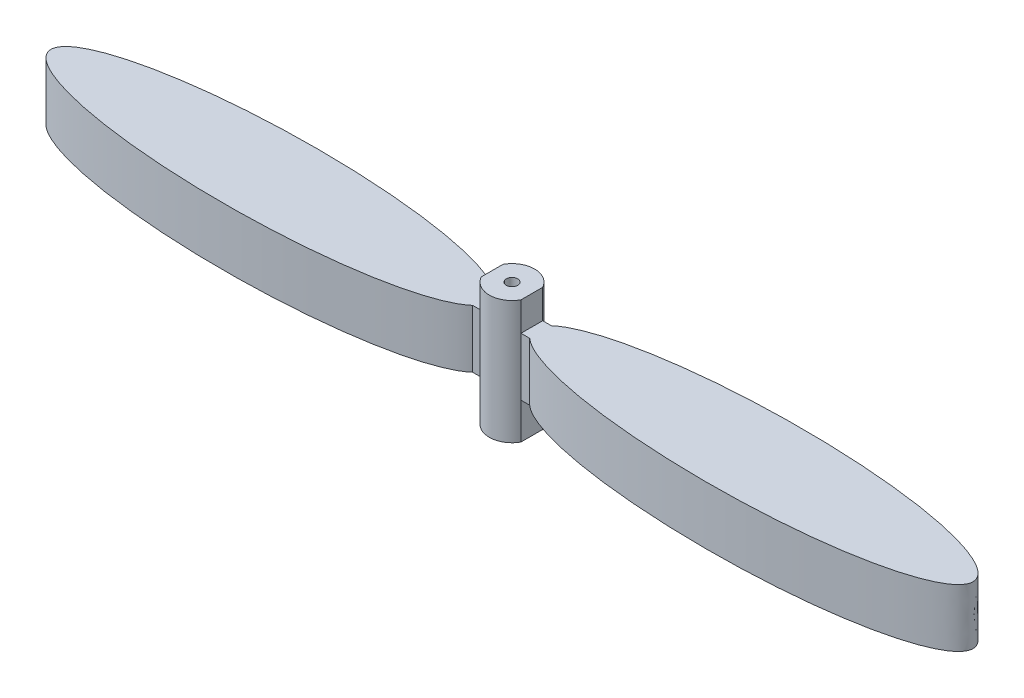
ISO-10303-21;
HEADER;
FILE_DESCRIPTION(('STEP AP214'),'2;1');
FILE_NAME('part.step','',(''),(''),'','','');
FILE_SCHEMA(('AUTOMOTIVE_DESIGN { 1 0 10303 214 1 1 1 1 }'));
ENDSEC;
DATA;
#1=APPLICATION_CONTEXT('core data for automotive mechanical design processes');
#2=APPLICATION_PROTOCOL_DEFINITION('international standard','automotive_design',2000,#1);
#3=PRODUCT_CONTEXT('',#1,'mechanical');
#4=PRODUCT('Part','Part','',(#3));
#5=PRODUCT_RELATED_PRODUCT_CATEGORY('part','',(#4));
#6=PRODUCT_DEFINITION_FORMATION('','',#4);
#7=PRODUCT_DEFINITION_CONTEXT('part definition',#1,'design');
#8=PRODUCT_DEFINITION('design','',#6,#7);
#9=PRODUCT_DEFINITION_SHAPE('','',#8);
#10=(LENGTH_UNIT() NAMED_UNIT(*) SI_UNIT(.MILLI.,.METRE.));
#11=(NAMED_UNIT(*) PLANE_ANGLE_UNIT() SI_UNIT($,.RADIAN.));
#12=(NAMED_UNIT(*) SI_UNIT($,.STERADIAN.) SOLID_ANGLE_UNIT());
#13=UNCERTAINTY_MEASURE_WITH_UNIT(LENGTH_MEASURE(1.E-05),#10,'distance_accuracy_value','');
#14=(GEOMETRIC_REPRESENTATION_CONTEXT(3) GLOBAL_UNCERTAINTY_ASSIGNED_CONTEXT((#13)) GLOBAL_UNIT_ASSIGNED_CONTEXT((#10,
#11,#12)) REPRESENTATION_CONTEXT('',''));
#15=CARTESIAN_POINT('',(0.,0.,0.));
#16=DIRECTION('',(0.,0.,1.));
#17=DIRECTION('',(1.,0.,0.));
#18=AXIS2_PLACEMENT_3D('',#15,#16,#17);
#19=CARTESIAN_POINT('',(-66.75,34.,0.));
#20=DIRECTION('',(0.,1.,0.));
#21=DIRECTION('',(0.,0.,1.));
#22=AXIS2_PLACEMENT_3D('',#19,#20,#21);
#23=PLANE('',#22);
#24=DIRECTION('',(0.,0.,1.));
#25=VECTOR('',#24,1.);
#26=CARTESIAN_POINT('',(5.48292804986533,34.,-17.));
#27=LINE('',#26,#25);
#28=CARTESIAN_POINT('',(5.48292804986533,34.,-3.));
#29=VERTEX_POINT('',#28);
#30=CARTESIAN_POINT('',(5.48292804986533,34.,3.));
#31=VERTEX_POINT('',#30);
#32=EDGE_CURVE('E256',#29,#31,#27,.T.);
#33=ORIENTED_EDGE('',*,*,#32,.F.);
#34=CARTESIAN_POINT('',(0.,34.,0.));
#35=DIRECTION('',(0.,1.,0.));
#36=DIRECTION('',(0.,0.,1.));
#37=AXIS2_PLACEMENT_3D('',#34,#35,#36);
#38=CIRCLE('',#37,6.25);
#39=CARTESIAN_POINT('',(-5.48292804986533,34.,-3.));
#40=VERTEX_POINT('',#39);
#41=EDGE_CURVE('E188',#29,#40,#38,.T.);
#42=ORIENTED_EDGE('',*,*,#41,.T.);
#43=DIRECTION('',(0.,0.,1.));
#44=VECTOR('',#43,1.);
#45=CARTESIAN_POINT('',(-5.48292804986533,34.,-17.));
#46=LINE('',#45,#44);
#47=CARTESIAN_POINT('',(-5.48292804986533,34.,3.));
#48=VERTEX_POINT('',#47);
#49=EDGE_CURVE('E250',#40,#48,#46,.T.);
#50=ORIENTED_EDGE('',*,*,#49,.T.);
#51=CARTESIAN_POINT('',(0.,34.,0.));
#52=DIRECTION('',(0.,1.,0.));
#53=DIRECTION('',(0.,0.,1.));
#54=AXIS2_PLACEMENT_3D('',#51,#52,#53);
#55=CIRCLE('',#54,6.25);
#56=EDGE_CURVE('E195',#48,#31,#55,.T.);
#57=ORIENTED_EDGE('',*,*,#56,.T.);
#58=EDGE_LOOP('',(#33,#42,#50,#57));
#59=FACE_BOUND('',#58,.T.);
#60=CARTESIAN_POINT('',(0.,34.,0.));
#61=DIRECTION('',(0.,1.,0.));
#62=DIRECTION('',(0.,0.,1.));
#63=AXIS2_PLACEMENT_3D('',#60,#61,#62);
#64=CIRCLE('',#63,1.575);
#65=CARTESIAN_POINT('',(0.,34.,1.575));
#66=VERTEX_POINT('',#65);
#67=EDGE_CURVE('E192',#66,#66,#64,.T.);
#68=ORIENTED_EDGE('',*,*,#67,.F.);
#69=EDGE_LOOP('',(#68));
#70=FACE_BOUND('',#69,.T.);
#71=ADVANCED_FACE('F35',(#59,#70),#23,.T.);
#72=CARTESIAN_POINT('',(-66.75,0.,0.));
#73=DIRECTION('',(0.,1.,0.));
#74=DIRECTION('',(0.,0.,1.));
#75=AXIS2_PLACEMENT_3D('',#72,#73,#74);
#76=PLANE('',#75);
#77=CARTESIAN_POINT('',(0.,0.,0.));
#78=DIRECTION('',(0.,1.,0.));
#79=DIRECTION('',(0.,0.,1.));
#80=AXIS2_PLACEMENT_3D('',#77,#78,#79);
#81=CIRCLE('',#80,6.25);
#82=CARTESIAN_POINT('',(5.48292804986533,0.,-3.));
#83=VERTEX_POINT('',#82);
#84=CARTESIAN_POINT('',(-5.48292804986533,0.,-3.));
#85=VERTEX_POINT('',#84);
#86=EDGE_CURVE('E189',#83,#85,#81,.T.);
#87=ORIENTED_EDGE('',*,*,#86,.F.);
#88=DIRECTION('',(0.,0.,1.));
#89=VECTOR('',#88,1.);
#90=CARTESIAN_POINT('',(5.48292804986533,0.,-17.));
#91=LINE('',#90,#89);
#92=CARTESIAN_POINT('',(5.48292804986533,0.,3.));
#93=VERTEX_POINT('',#92);
#94=EDGE_CURVE('E138',#83,#93,#91,.T.);
#95=ORIENTED_EDGE('',*,*,#94,.T.);
#96=CARTESIAN_POINT('',(0.,0.,0.));
#97=DIRECTION('',(0.,1.,0.));
#98=DIRECTION('',(0.,0.,1.));
#99=AXIS2_PLACEMENT_3D('',#96,#97,#98);
#100=CIRCLE('',#99,6.25);
#101=CARTESIAN_POINT('',(-5.48292804986533,0.,3.));
#102=VERTEX_POINT('',#101);
#103=EDGE_CURVE('E148',#102,#93,#100,.T.);
#104=ORIENTED_EDGE('',*,*,#103,.F.);
#105=DIRECTION('',(0.,0.,1.));
#106=VECTOR('',#105,1.);
#107=CARTESIAN_POINT('',(-5.48292804986533,0.,-17.));
#108=LINE('',#107,#106);
#109=EDGE_CURVE('E235',#85,#102,#108,.T.);
#110=ORIENTED_EDGE('',*,*,#109,.F.);
#111=EDGE_LOOP('',(#87,#95,#104,#110));
#112=FACE_BOUND('',#111,.T.);
#113=CARTESIAN_POINT('',(0.,0.,0.));
#114=DIRECTION('',(0.,1.,0.));
#115=DIRECTION('',(0.,0.,1.));
#116=AXIS2_PLACEMENT_3D('',#113,#114,#115);
#117=CIRCLE('',#116,1.575);
#118=CARTESIAN_POINT('',(0.,0.,1.575));
#119=VERTEX_POINT('',#118);
#120=EDGE_CURVE('E218',#119,#119,#117,.T.);
#121=ORIENTED_EDGE('',*,*,#120,.T.);
#122=EDGE_LOOP('',(#121));
#123=FACE_BOUND('',#122,.T.);
#124=ADVANCED_FACE('F262',(#112,#123),#76,.F.);
#125=CARTESIAN_POINT('',(0.,34.,0.));
#126=DIRECTION('',(0.,-1.,0.));
#127=DIRECTION('',(0.,0.,-1.));
#128=AXIS2_PLACEMENT_3D('',#125,#126,#127);
#129=CYLINDRICAL_SURFACE('',#128,6.25);
#130=ORIENTED_EDGE('',*,*,#86,.T.);
#131=DIRECTION('',(0.,1.,0.));
#132=VECTOR('',#131,1.);
#133=CARTESIAN_POINT('',(-5.48292804986533,34.,-3.));
#134=LINE('',#133,#132);
#135=CARTESIAN_POINT('',(-5.48292804986533,10.,-3.));
#136=VERTEX_POINT('',#135);
#137=EDGE_CURVE('E221',#85,#136,#134,.T.);
#138=ORIENTED_EDGE('',*,*,#137,.T.);
#139=DIRECTION('',(0.,-1.,0.));
#140=VECTOR('',#139,1.);
#141=CARTESIAN_POINT('',(-5.48292804986533,34.,-3.));
#142=LINE('',#141,#140);
#143=CARTESIAN_POINT('',(-5.48292804986533,26.,-3.));
#144=VERTEX_POINT('',#143);
#145=EDGE_CURVE('E170',#144,#136,#142,.T.);
#146=ORIENTED_EDGE('',*,*,#145,.F.);
#147=EDGE_CURVE('E171',#40,#144,#142,.T.);
#148=ORIENTED_EDGE('',*,*,#147,.F.);
#149=ORIENTED_EDGE('',*,*,#41,.F.);
#150=DIRECTION('',(0.,-1.,0.));
#151=VECTOR('',#150,1.);
#152=CARTESIAN_POINT('',(5.48292804986533,34.,-3.));
#153=LINE('',#152,#151);
#154=CARTESIAN_POINT('',(5.48292804986533,26.,-3.));
#155=VERTEX_POINT('',#154);
#156=EDGE_CURVE('E184',#29,#155,#153,.T.);
#157=ORIENTED_EDGE('',*,*,#156,.T.);
#158=CARTESIAN_POINT('',(5.48292804986533,9.99999999999999,-3.));
#159=VERTEX_POINT('',#158);
#160=EDGE_CURVE('E178',#155,#159,#153,.T.);
#161=ORIENTED_EDGE('',*,*,#160,.T.);
#162=EDGE_CURVE('E137',#159,#83,#153,.T.);
#163=ORIENTED_EDGE('',*,*,#162,.T.);
#164=EDGE_LOOP('',(#130,#138,#146,#148,#149,#157,#161,#163));
#165=FACE_BOUND('',#164,.T.);
#166=ADVANCED_FACE('F37',(#165),#129,.T.);
#167=CARTESIAN_POINT('',(-5.48292804986533,34.,-3.));
#168=DIRECTION('',(0.,0.,1.));
#169=DIRECTION('',(1.,0.,0.));
#170=AXIS2_PLACEMENT_3D('',#167,#168,#169);
#171=PLANE('',#170);
#172=DIRECTION('',(0.,-1.,0.));
#173=VECTOR('',#172,1.);
#174=CARTESIAN_POINT('',(-7.8829850953271,34.,-3.));
#175=LINE('',#174,#173);
#176=CARTESIAN_POINT('',(-7.8829850953271,26.,-3.));
#177=VERTEX_POINT('',#176);
#178=CARTESIAN_POINT('',(-7.8829850953271,10.,-3.));
#179=VERTEX_POINT('',#178);
#180=EDGE_CURVE('E168',#177,#179,#175,.T.);
#181=ORIENTED_EDGE('',*,*,#180,.F.);
#182=DIRECTION('',(1.,0.,0.));
#183=VECTOR('',#182,1.);
#184=CARTESIAN_POINT('',(-5.48292804986533,26.,-3.));
#185=LINE('',#184,#183);
#186=EDGE_CURVE('E239',#177,#144,#185,.T.);
#187=ORIENTED_EDGE('',*,*,#186,.T.);
#188=ORIENTED_EDGE('',*,*,#145,.T.);
#189=DIRECTION('',(-1.,0.,0.));
#190=VECTOR('',#189,1.);
#191=CARTESIAN_POINT('',(-5.48292804986532,10.,-3.));
#192=LINE('',#191,#190);
#193=EDGE_CURVE('E226',#136,#179,#192,.T.);
#194=ORIENTED_EDGE('',*,*,#193,.T.);
#195=EDGE_LOOP('',(#181,#187,#188,#194));
#196=FACE_BOUND('',#195,.T.);
#197=ADVANCED_FACE('F212',(#196),#171,.F.);
#198=CARTESIAN_POINT('',(-66.75,34.,0.));
#199=DIRECTION('',(0.,1.,0.));
#200=DIRECTION('',(-1.,0.,0.));
#201=AXIS2_PLACEMENT_3D('',#198,#199,#200);
#202=ELLIPSE('',#201,60.5,13.);
#203=DIRECTION('',(0.,-1.,0.));
#204=VECTOR('',#203,1.);
#205=SURFACE_OF_LINEAR_EXTRUSION('',#202,#204);
#206=DIRECTION('',(0.,-1.,0.));
#207=VECTOR('',#206,1.);
#208=CARTESIAN_POINT('',(-7.8829850953271,34.,3.));
#209=LINE('',#208,#207);
#210=CARTESIAN_POINT('',(-7.8829850953271,26.,3.));
#211=VERTEX_POINT('',#210);
#212=CARTESIAN_POINT('',(-7.8829850953271,10.,3.));
#213=VERTEX_POINT('',#212);
#214=EDGE_CURVE('E165',#211,#213,#209,.T.);
#215=ORIENTED_EDGE('',*,*,#214,.F.);
#216=CARTESIAN_POINT('',(-66.75,26.,0.));
#217=DIRECTION('',(0.,1.,0.));
#218=DIRECTION('',(-1.,0.,0.));
#219=AXIS2_PLACEMENT_3D('',#216,#217,#218);
#220=ELLIPSE('',#219,60.5,13.);
#221=EDGE_CURVE('E243',#211,#177,#220,.F.);
#222=ORIENTED_EDGE('',*,*,#221,.T.);
#223=ORIENTED_EDGE('',*,*,#180,.T.);
#224=CARTESIAN_POINT('',(-66.75,10.,0.));
#225=DIRECTION('',(0.,1.,0.));
#226=DIRECTION('',(-1.,0.,0.));
#227=AXIS2_PLACEMENT_3D('',#224,#225,#226);
#228=ELLIPSE('',#227,60.5,13.);
#229=EDGE_CURVE('E229',#179,#213,#228,.T.);
#230=ORIENTED_EDGE('',*,*,#229,.T.);
#231=EDGE_LOOP('',(#215,#222,#223,#230));
#232=FACE_BOUND('',#231,.T.);
#233=ADVANCED_FACE('F209',(#232),#205,.F.);
#234=CARTESIAN_POINT('',(-5.48292804986533,34.,3.));
#235=DIRECTION('',(0.,0.,-1.));
#236=DIRECTION('',(-1.,0.,0.));
#237=AXIS2_PLACEMENT_3D('',#234,#235,#236);
#238=PLANE('',#237);
#239=DIRECTION('',(0.,-1.,0.));
#240=VECTOR('',#239,1.);
#241=CARTESIAN_POINT('',(-5.48292804986533,34.,3.));
#242=LINE('',#241,#240);
#243=CARTESIAN_POINT('',(-5.48292804986533,26.,3.));
#244=VERTEX_POINT('',#243);
#245=CARTESIAN_POINT('',(-5.48292804986533,10.,3.));
#246=VERTEX_POINT('',#245);
#247=EDGE_CURVE('E166',#244,#246,#242,.T.);
#248=ORIENTED_EDGE('',*,*,#247,.F.);
#249=DIRECTION('',(-1.,0.,0.));
#250=VECTOR('',#249,1.);
#251=CARTESIAN_POINT('',(-5.48292804986533,26.,3.));
#252=LINE('',#251,#250);
#253=EDGE_CURVE('E246',#244,#211,#252,.T.);
#254=ORIENTED_EDGE('',*,*,#253,.T.);
#255=ORIENTED_EDGE('',*,*,#214,.T.);
#256=DIRECTION('',(1.,0.,0.));
#257=VECTOR('',#256,1.);
#258=CARTESIAN_POINT('',(-5.48292804986533,10.,3.));
#259=LINE('',#258,#257);
#260=EDGE_CURVE('E232',#213,#246,#259,.T.);
#261=ORIENTED_EDGE('',*,*,#260,.T.);
#262=EDGE_LOOP('',(#248,#254,#255,#261));
#263=FACE_BOUND('',#262,.T.);
#264=ADVANCED_FACE('F206',(#263),#238,.F.);
#265=CARTESIAN_POINT('',(0.,34.,0.));
#266=DIRECTION('',(0.,-1.,0.));
#267=DIRECTION('',(0.,0.,-1.));
#268=AXIS2_PLACEMENT_3D('',#265,#266,#267);
#269=CYLINDRICAL_SURFACE('',#268,6.25);
#270=ORIENTED_EDGE('',*,*,#103,.T.);
#271=DIRECTION('',(0.,1.,0.));
#272=VECTOR('',#271,1.);
#273=CARTESIAN_POINT('',(5.48292804986534,34.,3.));
#274=LINE('',#273,#272);
#275=CARTESIAN_POINT('',(5.48292804986533,9.99999999999998,3.));
#276=VERTEX_POINT('',#275);
#277=EDGE_CURVE('E130',#93,#276,#274,.T.);
#278=ORIENTED_EDGE('',*,*,#277,.T.);
#279=DIRECTION('',(0.,-1.,0.));
#280=VECTOR('',#279,1.);
#281=CARTESIAN_POINT('',(5.48292804986533,34.,3.));
#282=LINE('',#281,#280);
#283=CARTESIAN_POINT('',(5.48292804986533,26.,3.));
#284=VERTEX_POINT('',#283);
#285=EDGE_CURVE('E145',#284,#276,#282,.T.);
#286=ORIENTED_EDGE('',*,*,#285,.F.);
#287=EDGE_CURVE('E154',#31,#284,#282,.T.);
#288=ORIENTED_EDGE('',*,*,#287,.F.);
#289=ORIENTED_EDGE('',*,*,#56,.F.);
#290=EDGE_CURVE('E162',#48,#244,#242,.T.);
#291=ORIENTED_EDGE('',*,*,#290,.T.);
#292=ORIENTED_EDGE('',*,*,#247,.T.);
#293=EDGE_CURVE('E157',#246,#102,#242,.T.);
#294=ORIENTED_EDGE('',*,*,#293,.T.);
#295=EDGE_LOOP('',(#270,#278,#286,#288,#289,#291,#292,#294));
#296=FACE_BOUND('',#295,.T.);
#297=ADVANCED_FACE('F143',(#296),#269,.T.);
#298=CARTESIAN_POINT('',(7.8829850953271,34.,3.));
#299=DIRECTION('',(0.,0.,-1.));
#300=DIRECTION('',(-1.,0.,0.));
#301=AXIS2_PLACEMENT_3D('',#298,#299,#300);
#302=PLANE('',#301);
#303=ORIENTED_EDGE('',*,*,#285,.T.);
#304=DIRECTION('',(1.,0.,0.));
#305=VECTOR('',#304,1.);
#306=CARTESIAN_POINT('',(7.8829850953271,9.99999999999999,3.));
#307=LINE('',#306,#305);
#308=CARTESIAN_POINT('',(7.88298509532708,10.,2.99999999999999));
#309=VERTEX_POINT('',#308);
#310=EDGE_CURVE('E123',#276,#309,#307,.T.);
#311=ORIENTED_EDGE('',*,*,#310,.T.);
#312=DIRECTION('',(0.,-1.,0.));
#313=VECTOR('',#312,1.);
#314=CARTESIAN_POINT('',(7.88298509532709,34.,3.));
#315=LINE('',#314,#313);
#316=CARTESIAN_POINT('',(7.88298509532708,26.,2.99999999999999));
#317=VERTEX_POINT('',#316);
#318=EDGE_CURVE('E155',#317,#309,#315,.T.);
#319=ORIENTED_EDGE('',*,*,#318,.F.);
#320=DIRECTION('',(-1.,0.,0.));
#321=VECTOR('',#320,1.);
#322=CARTESIAN_POINT('',(7.8829850953271,26.,3.));
#323=LINE('',#322,#321);
#324=EDGE_CURVE('E153',#317,#284,#323,.T.);
#325=ORIENTED_EDGE('',*,*,#324,.T.);
#326=EDGE_LOOP('',(#303,#311,#319,#325));
#327=FACE_BOUND('',#326,.T.);
#328=ADVANCED_FACE('F152',(#327),#302,.F.);
#329=CARTESIAN_POINT('',(66.75,34.,0.));
#330=DIRECTION('',(0.,1.,0.));
#331=DIRECTION('',(1.,0.,0.));
#332=AXIS2_PLACEMENT_3D('',#329,#330,#331);
#333=ELLIPSE('',#332,60.5,13.);
#334=DIRECTION('',(0.,-1.,0.));
#335=VECTOR('',#334,1.);
#336=SURFACE_OF_LINEAR_EXTRUSION('',#333,#335);
#337=CARTESIAN_POINT('',(66.75,10.,0.));
#338=DIRECTION('',(0.,1.,0.));
#339=DIRECTION('',(1.,0.,0.));
#340=AXIS2_PLACEMENT_3D('',#337,#338,#339);
#341=ELLIPSE('',#340,60.5,13.);
#342=CARTESIAN_POINT('',(7.8829850953271,9.99999999999999,-3.));
#343=VERTEX_POINT('',#342);
#344=EDGE_CURVE('E125',#309,#343,#341,.T.);
#345=ORIENTED_EDGE('',*,*,#344,.T.);
#346=DIRECTION('',(0.,-1.,0.));
#347=VECTOR('',#346,1.);
#348=CARTESIAN_POINT('',(7.8829850953271,34.,-3.));
#349=LINE('',#348,#347);
#350=CARTESIAN_POINT('',(7.8829850953271,26.,-3.));
#351=VERTEX_POINT('',#350);
#352=EDGE_CURVE('E158',#351,#343,#349,.T.);
#353=ORIENTED_EDGE('',*,*,#352,.F.);
#354=CARTESIAN_POINT('',(66.75,26.,0.));
#355=DIRECTION('',(0.,1.,0.));
#356=DIRECTION('',(1.,0.,0.));
#357=AXIS2_PLACEMENT_3D('',#354,#355,#356);
#358=ELLIPSE('',#357,60.5,13.);
#359=EDGE_CURVE('E58',#351,#317,#358,.F.);
#360=ORIENTED_EDGE('',*,*,#359,.T.);
#361=ORIENTED_EDGE('',*,*,#318,.T.);
#362=EDGE_LOOP('',(#345,#353,#360,#361));
#363=FACE_BOUND('',#362,.T.);
#364=ADVANCED_FACE('F183',(#363),#336,.F.);
#365=CARTESIAN_POINT('',(7.8829850953271,34.,-3.));
#366=DIRECTION('',(0.,0.,1.));
#367=DIRECTION('',(1.,0.,0.));
#368=AXIS2_PLACEMENT_3D('',#365,#366,#367);
#369=PLANE('',#368);
#370=ORIENTED_EDGE('',*,*,#352,.T.);
#371=DIRECTION('',(-1.,0.,0.));
#372=VECTOR('',#371,1.);
#373=CARTESIAN_POINT('',(7.8829850953271,9.99999999999999,-3.));
#374=LINE('',#373,#372);
#375=EDGE_CURVE('E11',#343,#159,#374,.T.);
#376=ORIENTED_EDGE('',*,*,#375,.T.);
#377=ORIENTED_EDGE('',*,*,#160,.F.);
#378=DIRECTION('',(1.,0.,0.));
#379=VECTOR('',#378,1.);
#380=CARTESIAN_POINT('',(7.8829850953271,26.,-3.));
#381=LINE('',#380,#379);
#382=EDGE_CURVE('E43',#155,#351,#381,.T.);
#383=ORIENTED_EDGE('',*,*,#382,.T.);
#384=EDGE_LOOP('',(#370,#376,#377,#383));
#385=FACE_BOUND('',#384,.T.);
#386=ADVANCED_FACE('F176',(#385),#369,.F.);
#387=CARTESIAN_POINT('',(0.,34.,0.));
#388=DIRECTION('',(0.,-1.,0.));
#389=DIRECTION('',(0.,0.,-1.));
#390=AXIS2_PLACEMENT_3D('',#387,#388,#389);
#391=CYLINDRICAL_SURFACE('',#390,1.575);
#392=ORIENTED_EDGE('',*,*,#67,.T.);
#393=EDGE_LOOP('',(#392));
#394=FACE_BOUND('',#393,.T.);
#395=ORIENTED_EDGE('',*,*,#120,.F.);
#396=EDGE_LOOP('',(#395));
#397=FACE_BOUND('',#396,.T.);
#398=ADVANCED_FACE('F291',(#394,#397),#391,.F.);
#399=CARTESIAN_POINT('',(-5.48292804986533,0.,-17.));
#400=DIRECTION('',(1.,0.,0.));
#401=DIRECTION('',(0.,0.,-1.));
#402=AXIS2_PLACEMENT_3D('',#399,#400,#401);
#403=PLANE('',#402);
#404=ORIENTED_EDGE('',*,*,#109,.T.);
#405=ORIENTED_EDGE('',*,*,#293,.F.);
#406=DIRECTION('',(0.,0.,1.));
#407=VECTOR('',#406,1.);
#408=CARTESIAN_POINT('',(-5.48292804986533,10.,-17.));
#409=LINE('',#408,#407);
#410=EDGE_CURVE('E236',#136,#246,#409,.T.);
#411=ORIENTED_EDGE('',*,*,#410,.F.);
#412=ORIENTED_EDGE('',*,*,#137,.F.);
#413=EDGE_LOOP('',(#404,#405,#411,#412));
#414=FACE_BOUND('',#413,.T.);
#415=ADVANCED_FACE('F294',(#414),#403,.F.);
#416=CARTESIAN_POINT('',(-5.48292804986533,10.,-17.));
#417=DIRECTION('',(0.,1.,0.));
#418=DIRECTION('',(-1.,0.,0.));
#419=AXIS2_PLACEMENT_3D('',#416,#417,#418);
#420=PLANE('',#419);
#421=ORIENTED_EDGE('',*,*,#410,.T.);
#422=ORIENTED_EDGE('',*,*,#260,.F.);
#423=ORIENTED_EDGE('',*,*,#229,.F.);
#424=ORIENTED_EDGE('',*,*,#193,.F.);
#425=EDGE_LOOP('',(#421,#422,#423,#424));
#426=FACE_BOUND('',#425,.T.);
#427=ADVANCED_FACE('F298',(#426),#420,.F.);
#428=CARTESIAN_POINT('',(-5.48292804986533,26.,-17.));
#429=DIRECTION('',(1.,0.,0.));
#430=DIRECTION('',(0.,0.,-1.));
#431=AXIS2_PLACEMENT_3D('',#428,#429,#430);
#432=PLANE('',#431);
#433=DIRECTION('',(0.,0.,1.));
#434=VECTOR('',#433,1.);
#435=CARTESIAN_POINT('',(-5.48292804986533,26.,-17.));
#436=LINE('',#435,#434);
#437=EDGE_CURVE('E249',#144,#244,#436,.T.);
#438=ORIENTED_EDGE('',*,*,#437,.T.);
#439=ORIENTED_EDGE('',*,*,#290,.F.);
#440=ORIENTED_EDGE('',*,*,#49,.F.);
#441=ORIENTED_EDGE('',*,*,#147,.T.);
#442=EDGE_LOOP('',(#438,#439,#440,#441));
#443=FACE_BOUND('',#442,.T.);
#444=ADVANCED_FACE('F302',(#443),#432,.F.);
#445=CARTESIAN_POINT('',(-5.48292804986533,26.,-17.));
#446=DIRECTION('',(0.,-1.,0.));
#447=DIRECTION('',(1.,0.,0.));
#448=AXIS2_PLACEMENT_3D('',#445,#446,#447);
#449=PLANE('',#448);
#450=ORIENTED_EDGE('',*,*,#221,.F.);
#451=ORIENTED_EDGE('',*,*,#253,.F.);
#452=ORIENTED_EDGE('',*,*,#437,.F.);
#453=ORIENTED_EDGE('',*,*,#186,.F.);
#454=EDGE_LOOP('',(#450,#451,#452,#453));
#455=FACE_BOUND('',#454,.T.);
#456=ADVANCED_FACE('F282',(#455),#449,.F.);
#457=CARTESIAN_POINT('',(5.48292804986533,34.,-17.));
#458=DIRECTION('',(-1.,0.,0.));
#459=DIRECTION('',(0.,-1.,0.));
#460=AXIS2_PLACEMENT_3D('',#457,#458,#459);
#461=PLANE('',#460);
#462=DIRECTION('',(0.,0.,1.));
#463=VECTOR('',#462,1.);
#464=CARTESIAN_POINT('',(5.48292804986533,26.,-17.));
#465=LINE('',#464,#463);
#466=EDGE_CURVE('E149',#155,#284,#465,.T.);
#467=ORIENTED_EDGE('',*,*,#466,.F.);
#468=ORIENTED_EDGE('',*,*,#156,.F.);
#469=ORIENTED_EDGE('',*,*,#32,.T.);
#470=ORIENTED_EDGE('',*,*,#287,.T.);
#471=EDGE_LOOP('',(#467,#468,#469,#470));
#472=FACE_BOUND('',#471,.T.);
#473=ADVANCED_FACE('F273',(#472),#461,.F.);
#474=CARTESIAN_POINT('',(5.48292804986533,26.,-17.));
#475=DIRECTION('',(0.,-1.,0.));
#476=DIRECTION('',(0.,0.,-1.));
#477=AXIS2_PLACEMENT_3D('',#474,#475,#476);
#478=PLANE('',#477);
#479=ORIENTED_EDGE('',*,*,#359,.F.);
#480=ORIENTED_EDGE('',*,*,#382,.F.);
#481=ORIENTED_EDGE('',*,*,#466,.T.);
#482=ORIENTED_EDGE('',*,*,#324,.F.);
#483=EDGE_LOOP('',(#479,#480,#481,#482));
#484=FACE_BOUND('',#483,.T.);
#485=ADVANCED_FACE('F274',(#484),#478,.F.);
#486=CARTESIAN_POINT('',(5.48292804986533,9.99999999999998,-17.));
#487=DIRECTION('',(-1.,0.,0.));
#488=DIRECTION('',(0.,-1.,0.));
#489=AXIS2_PLACEMENT_3D('',#486,#487,#488);
#490=PLANE('',#489);
#491=ORIENTED_EDGE('',*,*,#94,.F.);
#492=ORIENTED_EDGE('',*,*,#162,.F.);
#493=DIRECTION('',(0.,0.,1.));
#494=VECTOR('',#493,1.);
#495=CARTESIAN_POINT('',(5.48292804986533,9.99999999999998,-17.));
#496=LINE('',#495,#494);
#497=EDGE_CURVE('E50',#159,#276,#496,.T.);
#498=ORIENTED_EDGE('',*,*,#497,.T.);
#499=ORIENTED_EDGE('',*,*,#277,.F.);
#500=EDGE_LOOP('',(#491,#492,#498,#499));
#501=FACE_BOUND('',#500,.T.);
#502=ADVANCED_FACE('F134',(#501),#490,.F.);
#503=CARTESIAN_POINT('',(127.25,10.,-17.));
#504=DIRECTION('',(0.,1.,0.));
#505=DIRECTION('',(-1.,0.,0.));
#506=AXIS2_PLACEMENT_3D('',#503,#504,#505);
#507=PLANE('',#506);
#508=ORIENTED_EDGE('',*,*,#497,.F.);
#509=ORIENTED_EDGE('',*,*,#375,.F.);
#510=ORIENTED_EDGE('',*,*,#344,.F.);
#511=ORIENTED_EDGE('',*,*,#310,.F.);
#512=EDGE_LOOP('',(#508,#509,#510,#511));
#513=FACE_BOUND('',#512,.T.);
#514=ADVANCED_FACE('F124',(#513),#507,.F.);
#515=CLOSED_SHELL('',(#71,#124,#166,#197,#233,#264,#297,#328,#364,#386,#398,#415,#427,#444,#456,
#473,#485,#502,#514));
#516=MANIFOLD_SOLID_BREP('B2',#515);
#517=ADVANCED_BREP_SHAPE_REPRESENTATION('',(#18,#516),#14);
#518=SHAPE_DEFINITION_REPRESENTATION(#9,#517);
ENDSEC;
END-ISO-10303-21;
